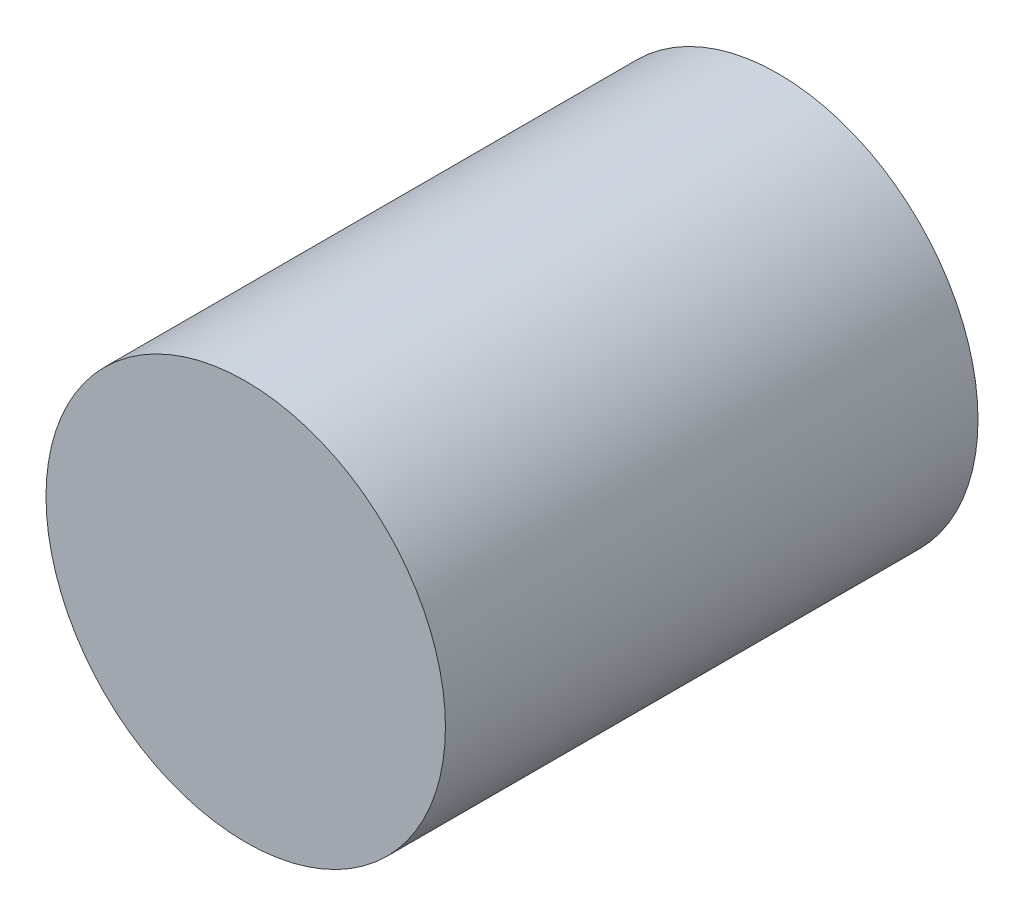
ISO-10303-21;
HEADER;
FILE_DESCRIPTION(('STEP AP214'),'2;1');
FILE_NAME('part.step','',(''),(''),'','','');
FILE_SCHEMA(('AUTOMOTIVE_DESIGN { 1 0 10303 214 1 1 1 1 }'));
ENDSEC;
DATA;
#1=APPLICATION_CONTEXT('core data for automotive mechanical design processes');
#2=APPLICATION_PROTOCOL_DEFINITION('international standard','automotive_design',2000,#1);
#3=PRODUCT_CONTEXT('',#1,'mechanical');
#4=PRODUCT('Part','Part','',(#3));
#5=PRODUCT_RELATED_PRODUCT_CATEGORY('part','',(#4));
#6=PRODUCT_DEFINITION_FORMATION('','',#4);
#7=PRODUCT_DEFINITION_CONTEXT('part definition',#1,'design');
#8=PRODUCT_DEFINITION('design','',#6,#7);
#9=PRODUCT_DEFINITION_SHAPE('','',#8);
#10=(LENGTH_UNIT() NAMED_UNIT(*) SI_UNIT(.MILLI.,.METRE.));
#11=(NAMED_UNIT(*) PLANE_ANGLE_UNIT() SI_UNIT($,.RADIAN.));
#12=(NAMED_UNIT(*) SI_UNIT($,.STERADIAN.) SOLID_ANGLE_UNIT());
#13=UNCERTAINTY_MEASURE_WITH_UNIT(LENGTH_MEASURE(1.E-05),#10,'distance_accuracy_value','');
#14=(GEOMETRIC_REPRESENTATION_CONTEXT(3) GLOBAL_UNCERTAINTY_ASSIGNED_CONTEXT((#13)) GLOBAL_UNIT_ASSIGNED_CONTEXT((#10,
#11,#12)) REPRESENTATION_CONTEXT('',''));
#15=CARTESIAN_POINT('',(0.,0.,0.));
#16=DIRECTION('',(0.,0.,1.));
#17=DIRECTION('',(1.,0.,0.));
#18=AXIS2_PLACEMENT_3D('',#15,#16,#17);
#19=CARTESIAN_POINT('',(0.,0.,40.));
#20=DIRECTION('',(0.,0.,-1.));
#21=DIRECTION('',(-1.,0.,0.));
#22=AXIS2_PLACEMENT_3D('',#19,#20,#21);
#23=CYLINDRICAL_SURFACE('',#22,6.3);
#24=DIRECTION('',(0.,0.,-1.));
#25=VECTOR('',#24,1.);
#26=CARTESIAN_POINT('',(-2.,5.97411081249754,40.));
#27=LINE('',#26,#25);
#28=CARTESIAN_POINT('',(-2.,5.97411081249754,20.));
#29=VERTEX_POINT('',#28);
#30=CARTESIAN_POINT('',(-2.,5.97411081249754,0.));
#31=VERTEX_POINT('',#30);
#32=EDGE_CURVE('E11',#29,#31,#27,.T.);
#33=ORIENTED_EDGE('',*,*,#32,.F.);
#34=CARTESIAN_POINT('',(0.,0.,20.));
#35=DIRECTION('',(0.,0.,1.));
#36=DIRECTION('',(1.,0.,0.));
#37=AXIS2_PLACEMENT_3D('',#34,#35,#36);
#38=CIRCLE('',#37,6.3);
#39=CARTESIAN_POINT('',(2.01028990669972,5.97065611897229,20.));
#40=VERTEX_POINT('',#39);
#41=EDGE_CURVE('E79',#29,#40,#38,.T.);
#42=ORIENTED_EDGE('',*,*,#41,.T.);
#43=DIRECTION('',(0.,0.,-1.));
#44=VECTOR('',#43,1.);
#45=CARTESIAN_POINT('',(2.01028990669972,5.97065611897229,40.));
#46=LINE('',#45,#44);
#47=CARTESIAN_POINT('',(2.01028990669972,5.97065611897229,0.));
#48=VERTEX_POINT('',#47);
#49=EDGE_CURVE('E61',#40,#48,#46,.T.);
#50=ORIENTED_EDGE('',*,*,#49,.T.);
#51=CARTESIAN_POINT('',(0.,0.,0.));
#52=DIRECTION('',(0.,0.,1.));
#53=DIRECTION('',(1.,0.,0.));
#54=AXIS2_PLACEMENT_3D('',#51,#52,#53);
#55=CIRCLE('',#54,6.3);
#56=EDGE_CURVE('E85',#31,#48,#55,.T.);
#57=ORIENTED_EDGE('',*,*,#56,.F.);
#58=EDGE_LOOP('',(#33,#42,#50,#57));
#59=FACE_BOUND('',#58,.T.);
#60=ADVANCED_FACE('F39',(#59),#23,.F.);
#61=CARTESIAN_POINT('',(-2.,0.,40.));
#62=DIRECTION('',(1.,0.,0.));
#63=DIRECTION('',(0.,1.,0.));
#64=AXIS2_PLACEMENT_3D('',#61,#62,#63);
#65=PLANE('',#64);
#66=DIRECTION('',(0.,0.,-1.));
#67=VECTOR('',#66,1.);
#68=CARTESIAN_POINT('',(-2.,10.,40.));
#69=LINE('',#68,#67);
#70=CARTESIAN_POINT('',(-2.,10.,20.));
#71=VERTEX_POINT('',#70);
#72=CARTESIAN_POINT('',(-2.,10.,0.));
#73=VERTEX_POINT('',#72);
#74=EDGE_CURVE('E46',#71,#73,#69,.T.);
#75=ORIENTED_EDGE('',*,*,#74,.F.);
#76=DIRECTION('',(0.,-1.,0.));
#77=VECTOR('',#76,1.);
#78=CARTESIAN_POINT('',(-2.,0.,20.));
#79=LINE('',#78,#77);
#80=EDGE_CURVE('E86',#71,#29,#79,.T.);
#81=ORIENTED_EDGE('',*,*,#80,.T.);
#82=ORIENTED_EDGE('',*,*,#32,.T.);
#83=DIRECTION('',(0.,-1.,0.));
#84=VECTOR('',#83,1.);
#85=CARTESIAN_POINT('',(-2.,0.,0.));
#86=LINE('',#85,#84);
#87=EDGE_CURVE('E110',#73,#31,#86,.T.);
#88=ORIENTED_EDGE('',*,*,#87,.F.);
#89=EDGE_LOOP('',(#75,#81,#82,#88));
#90=FACE_BOUND('',#89,.T.);
#91=ADVANCED_FACE('F111',(#90),#65,.T.);
#92=CARTESIAN_POINT('',(0.,10.,40.));
#93=DIRECTION('',(0.,-1.,0.));
#94=DIRECTION('',(0.,0.,-1.));
#95=AXIS2_PLACEMENT_3D('',#92,#93,#94);
#96=PLANE('',#95);
#97=DIRECTION('',(0.,0.,-1.));
#98=VECTOR('',#97,1.);
#99=CARTESIAN_POINT('',(2.01028990669972,10.,40.));
#100=LINE('',#99,#98);
#101=CARTESIAN_POINT('',(2.01028990669972,10.,20.));
#102=VERTEX_POINT('',#101);
#103=CARTESIAN_POINT('',(2.01028990669972,10.,0.));
#104=VERTEX_POINT('',#103);
#105=EDGE_CURVE('E92',#102,#104,#100,.T.);
#106=ORIENTED_EDGE('',*,*,#105,.F.);
#107=DIRECTION('',(-1.,0.,0.));
#108=VECTOR('',#107,1.);
#109=CARTESIAN_POINT('',(0.,10.,20.));
#110=LINE('',#109,#108);
#111=EDGE_CURVE('E53',#102,#71,#110,.T.);
#112=ORIENTED_EDGE('',*,*,#111,.T.);
#113=ORIENTED_EDGE('',*,*,#74,.T.);
#114=DIRECTION('',(-1.,0.,0.));
#115=VECTOR('',#114,1.);
#116=CARTESIAN_POINT('',(0.,10.,0.));
#117=LINE('',#116,#115);
#118=EDGE_CURVE('E107',#104,#73,#117,.T.);
#119=ORIENTED_EDGE('',*,*,#118,.F.);
#120=EDGE_LOOP('',(#106,#112,#113,#119));
#121=FACE_BOUND('',#120,.T.);
#122=ADVANCED_FACE('F105',(#121),#96,.T.);
#123=CARTESIAN_POINT('',(2.01028990669972,0.,40.));
#124=DIRECTION('',(-1.,0.,0.));
#125=DIRECTION('',(0.,0.,1.));
#126=AXIS2_PLACEMENT_3D('',#123,#124,#125);
#127=PLANE('',#126);
#128=ORIENTED_EDGE('',*,*,#49,.F.);
#129=DIRECTION('',(0.,1.,0.));
#130=VECTOR('',#129,1.);
#131=CARTESIAN_POINT('',(2.01028990669972,0.,20.));
#132=LINE('',#131,#130);
#133=EDGE_CURVE('E77',#40,#102,#132,.T.);
#134=ORIENTED_EDGE('',*,*,#133,.T.);
#135=ORIENTED_EDGE('',*,*,#105,.T.);
#136=DIRECTION('',(0.,1.,0.));
#137=VECTOR('',#136,1.);
#138=CARTESIAN_POINT('',(2.01028990669972,0.,0.));
#139=LINE('',#138,#137);
#140=EDGE_CURVE('E91',#48,#104,#139,.T.);
#141=ORIENTED_EDGE('',*,*,#140,.F.);
#142=EDGE_LOOP('',(#128,#134,#135,#141));
#143=FACE_BOUND('',#142,.T.);
#144=ADVANCED_FACE('F89',(#143),#127,.T.);
#145=CARTESIAN_POINT('',(0.,0.,40.));
#146=DIRECTION('',(0.,0.,-1.));
#147=DIRECTION('',(-1.,0.,0.));
#148=AXIS2_PLACEMENT_3D('',#145,#146,#147);
#149=CYLINDRICAL_SURFACE('',#148,15.);
#150=CARTESIAN_POINT('',(0.,0.,40.));
#151=DIRECTION('',(0.,0.,1.));
#152=DIRECTION('',(1.,0.,0.));
#153=AXIS2_PLACEMENT_3D('',#150,#151,#152);
#154=CIRCLE('',#153,15.);
#155=CARTESIAN_POINT('',(15.,0.,40.));
#156=VERTEX_POINT('',#155);
#157=EDGE_CURVE('E93',#156,#156,#154,.T.);
#158=ORIENTED_EDGE('',*,*,#157,.F.);
#159=EDGE_LOOP('',(#158));
#160=FACE_BOUND('',#159,.T.);
#161=CARTESIAN_POINT('',(0.,0.,0.));
#162=DIRECTION('',(0.,0.,1.));
#163=DIRECTION('',(1.,0.,0.));
#164=AXIS2_PLACEMENT_3D('',#161,#162,#163);
#165=CIRCLE('',#164,15.);
#166=CARTESIAN_POINT('',(15.,0.,0.));
#167=VERTEX_POINT('',#166);
#168=EDGE_CURVE('E97',#167,#167,#165,.T.);
#169=ORIENTED_EDGE('',*,*,#168,.T.);
#170=EDGE_LOOP('',(#169));
#171=FACE_BOUND('',#170,.T.);
#172=ADVANCED_FACE('F123',(#160,#171),#149,.T.);
#173=CARTESIAN_POINT('',(0.,0.,40.));
#174=DIRECTION('',(0.,0.,1.));
#175=DIRECTION('',(1.,0.,0.));
#176=AXIS2_PLACEMENT_3D('',#173,#174,#175);
#177=PLANE('',#176);
#178=ORIENTED_EDGE('',*,*,#157,.T.);
#179=EDGE_LOOP('',(#178));
#180=FACE_BOUND('',#179,.T.);
#181=ADVANCED_FACE('F125',(#180),#177,.T.);
#182=CARTESIAN_POINT('',(0.,0.,0.));
#183=DIRECTION('',(0.,0.,1.));
#184=DIRECTION('',(1.,0.,0.));
#185=AXIS2_PLACEMENT_3D('',#182,#183,#184);
#186=PLANE('',#185);
#187=ORIENTED_EDGE('',*,*,#56,.T.);
#188=ORIENTED_EDGE('',*,*,#140,.T.);
#189=ORIENTED_EDGE('',*,*,#118,.T.);
#190=ORIENTED_EDGE('',*,*,#87,.T.);
#191=EDGE_LOOP('',(#187,#188,#189,#190));
#192=FACE_BOUND('',#191,.T.);
#193=ORIENTED_EDGE('',*,*,#168,.F.);
#194=EDGE_LOOP('',(#193));
#195=FACE_BOUND('',#194,.T.);
#196=ADVANCED_FACE('F114',(#192,#195),#186,.F.);
#197=CARTESIAN_POINT('',(0.,0.,20.));
#198=DIRECTION('',(0.,0.,1.));
#199=DIRECTION('',(1.,0.,0.));
#200=AXIS2_PLACEMENT_3D('',#197,#198,#199);
#201=PLANE('',#200);
#202=ORIENTED_EDGE('',*,*,#41,.F.);
#203=ORIENTED_EDGE('',*,*,#80,.F.);
#204=ORIENTED_EDGE('',*,*,#111,.F.);
#205=ORIENTED_EDGE('',*,*,#133,.F.);
#206=EDGE_LOOP('',(#202,#203,#204,#205));
#207=FACE_BOUND('',#206,.T.);
#208=ADVANCED_FACE('F78',(#207),#201,.F.);
#209=CLOSED_SHELL('',(#60,#91,#122,#144,#172,#181,#196,#208));
#210=MANIFOLD_SOLID_BREP('B2',#209);
#211=ADVANCED_BREP_SHAPE_REPRESENTATION('',(#18,#210),#14);
#212=SHAPE_DEFINITION_REPRESENTATION(#9,#211);
ENDSEC;
END-ISO-10303-21;
